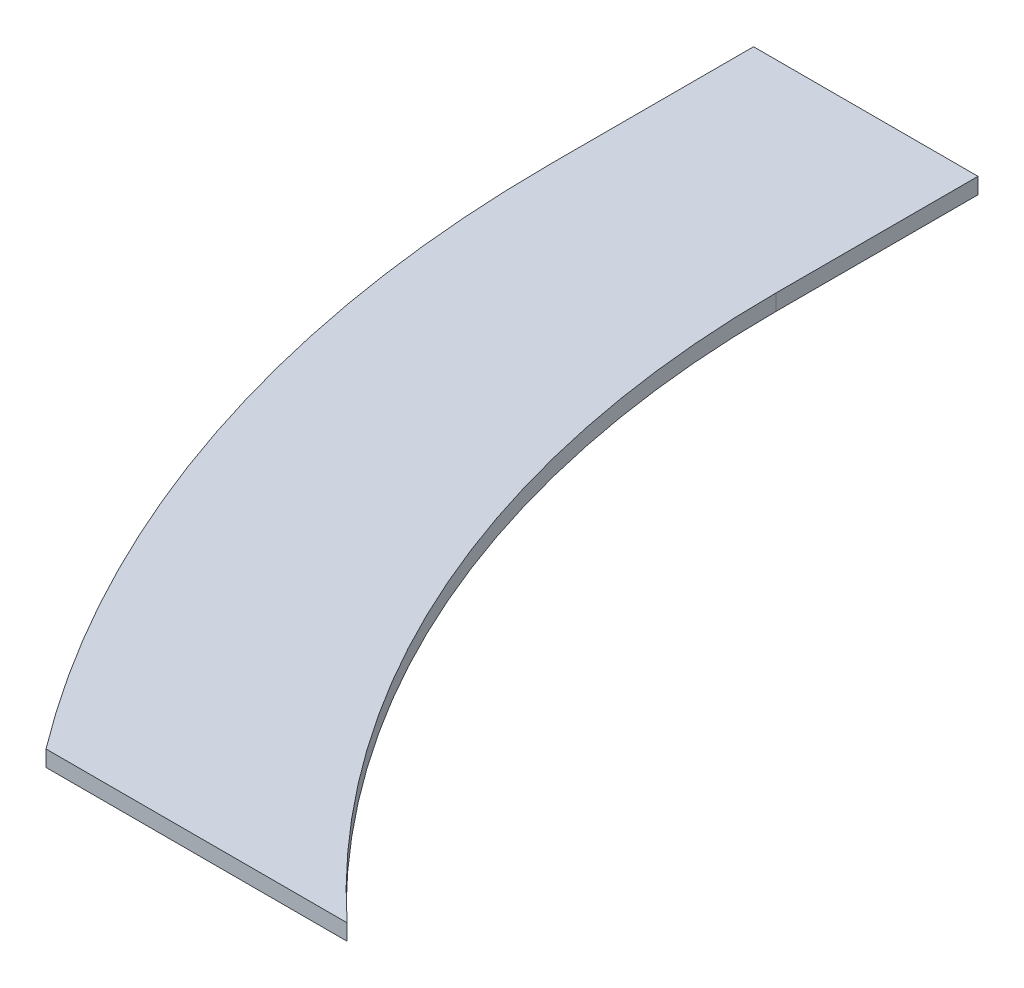
ISO-10303-21;
HEADER;
FILE_DESCRIPTION(('STEP AP214'),'2;1');
FILE_NAME('part.step','',(''),(''),'','','');
FILE_SCHEMA(('AUTOMOTIVE_DESIGN { 1 0 10303 214 1 1 1 1 }'));
ENDSEC;
DATA;
#1=APPLICATION_CONTEXT('core data for automotive mechanical design processes');
#2=APPLICATION_PROTOCOL_DEFINITION('international standard','automotive_design',2000,#1);
#3=PRODUCT_CONTEXT('',#1,'mechanical');
#4=PRODUCT('Part','Part','',(#3));
#5=PRODUCT_RELATED_PRODUCT_CATEGORY('part','',(#4));
#6=PRODUCT_DEFINITION_FORMATION('','',#4);
#7=PRODUCT_DEFINITION_CONTEXT('part definition',#1,'design');
#8=PRODUCT_DEFINITION('design','',#6,#7);
#9=PRODUCT_DEFINITION_SHAPE('','',#8);
#10=(LENGTH_UNIT() NAMED_UNIT(*) SI_UNIT(.MILLI.,.METRE.));
#11=(NAMED_UNIT(*) PLANE_ANGLE_UNIT() SI_UNIT($,.RADIAN.));
#12=(NAMED_UNIT(*) SI_UNIT($,.STERADIAN.) SOLID_ANGLE_UNIT());
#13=UNCERTAINTY_MEASURE_WITH_UNIT(LENGTH_MEASURE(1.E-05),#10,'distance_accuracy_value','');
#14=(GEOMETRIC_REPRESENTATION_CONTEXT(3) GLOBAL_UNCERTAINTY_ASSIGNED_CONTEXT((#13)) GLOBAL_UNIT_ASSIGNED_CONTEXT((#10,
#11,#12)) REPRESENTATION_CONTEXT('',''));
#15=CARTESIAN_POINT('',(0.,0.,0.));
#16=DIRECTION('',(0.,0.,1.));
#17=DIRECTION('',(1.,0.,0.));
#18=AXIS2_PLACEMENT_3D('',#15,#16,#17);
#19=CARTESIAN_POINT('',(0.,0.,301.));
#20=DIRECTION('',(0.,0.,-1.));
#21=DIRECTION('',(-1.,0.,0.));
#22=AXIS2_PLACEMENT_3D('',#19,#20,#21);
#23=PLANE('',#22);
#24=DIRECTION('',(-1.,0.,0.));
#25=VECTOR('',#24,1.);
#26=CARTESIAN_POINT('',(0.,6.35,301.));
#27=LINE('',#26,#25);
#28=CARTESIAN_POINT('',(-280.003946400761,6.35,301.));
#29=VERTEX_POINT('',#28);
#30=CARTESIAN_POINT('',(-399.248043201216,6.35,301.));
#31=VERTEX_POINT('',#30);
#32=EDGE_CURVE('E12',#29,#31,#27,.T.);
#33=ORIENTED_EDGE('',*,*,#32,.T.);
#34=DIRECTION('',(0.,-1.,0.));
#35=VECTOR('',#34,1.);
#36=CARTESIAN_POINT('',(-399.248043201216,6.35,301.));
#37=LINE('',#36,#35);
#38=CARTESIAN_POINT('',(-399.248043201216,0.,301.));
#39=VERTEX_POINT('',#38);
#40=EDGE_CURVE('E62',#39,#31,#37,.F.);
#41=ORIENTED_EDGE('',*,*,#40,.F.);
#42=DIRECTION('',(-1.,0.,0.));
#43=VECTOR('',#42,1.);
#44=CARTESIAN_POINT('',(0.,0.,301.));
#45=LINE('',#44,#43);
#46=CARTESIAN_POINT('',(-280.003946400761,0.,301.));
#47=VERTEX_POINT('',#46);
#48=EDGE_CURVE('E136',#47,#39,#45,.T.);
#49=ORIENTED_EDGE('',*,*,#48,.F.);
#50=DIRECTION('',(0.,-1.,0.));
#51=VECTOR('',#50,1.);
#52=CARTESIAN_POINT('',(-280.003946400761,6.35,301.));
#53=LINE('',#52,#51);
#54=EDGE_CURVE('E49',#47,#29,#53,.F.);
#55=ORIENTED_EDGE('',*,*,#54,.T.);
#56=EDGE_LOOP('',(#33,#41,#49,#55));
#57=FACE_BOUND('',#56,.T.);
#58=ADVANCED_FACE('F42',(#57),#23,.F.);
#59=CARTESIAN_POINT('',(-411.1,6.35,-79.9999999999999));
#60=DIRECTION('',(-1.,0.,0.));
#61=DIRECTION('',(0.,0.,1.));
#62=AXIS2_PLACEMENT_3D('',#59,#60,#61);
#63=PLANE('',#62);
#64=DIRECTION('',(0.,-1.,0.));
#65=VECTOR('',#64,1.);
#66=CARTESIAN_POINT('',(-411.1,6.35,0.));
#67=LINE('',#66,#65);
#68=CARTESIAN_POINT('',(-411.1,6.35,0.));
#69=VERTEX_POINT('',#68);
#70=CARTESIAN_POINT('',(-411.1,0.,0.));
#71=VERTEX_POINT('',#70);
#72=EDGE_CURVE('E117',#69,#71,#67,.T.);
#73=ORIENTED_EDGE('',*,*,#72,.T.);
#74=DIRECTION('',(0.,0.,1.));
#75=VECTOR('',#74,1.);
#76=CARTESIAN_POINT('',(-411.1,0.,-79.9999999999999));
#77=LINE('',#76,#75);
#78=CARTESIAN_POINT('',(-411.1,0.,-79.9999999999999));
#79=VERTEX_POINT('',#78);
#80=EDGE_CURVE('E98',#79,#71,#77,.T.);
#81=ORIENTED_EDGE('',*,*,#80,.F.);
#82=DIRECTION('',(0.,-1.,0.));
#83=VECTOR('',#82,1.);
#84=CARTESIAN_POINT('',(-411.1,6.35,-79.9999999999999));
#85=LINE('',#84,#83);
#86=CARTESIAN_POINT('',(-411.1,6.35,-79.9999999999999));
#87=VERTEX_POINT('',#86);
#88=EDGE_CURVE('E106',#87,#79,#85,.T.);
#89=ORIENTED_EDGE('',*,*,#88,.F.);
#90=DIRECTION('',(0.,0.,1.));
#91=VECTOR('',#90,1.);
#92=CARTESIAN_POINT('',(-411.1,6.35,-79.9999999999999));
#93=LINE('',#92,#91);
#94=EDGE_CURVE('E146',#87,#69,#93,.T.);
#95=ORIENTED_EDGE('',*,*,#94,.T.);
#96=EDGE_LOOP('',(#73,#81,#89,#95));
#97=FACE_BOUND('',#96,.T.);
#98=ADVANCED_FACE('F116',(#97),#63,.F.);
#99=CARTESIAN_POINT('',(0.,0.,-80.));
#100=DIRECTION('',(0.,0.,-1.));
#101=DIRECTION('',(-1.,0.,0.));
#102=AXIS2_PLACEMENT_3D('',#99,#100,#101);
#103=PLANE('',#102);
#104=ORIENTED_EDGE('',*,*,#88,.T.);
#105=DIRECTION('',(-1.,0.,0.));
#106=VECTOR('',#105,1.);
#107=CARTESIAN_POINT('',(-411.1,0.,-79.9999999999999));
#108=LINE('',#107,#106);
#109=CARTESIAN_POINT('',(-500.,0.,-79.9999999999999));
#110=VERTEX_POINT('',#109);
#111=EDGE_CURVE('E93',#79,#110,#108,.T.);
#112=ORIENTED_EDGE('',*,*,#111,.T.);
#113=DIRECTION('',(0.,1.,0.));
#114=VECTOR('',#113,1.);
#115=CARTESIAN_POINT('',(-500.,0.,-79.9999999999999));
#116=LINE('',#115,#114);
#117=CARTESIAN_POINT('',(-500.,6.35,-79.9999999999999));
#118=VERTEX_POINT('',#117);
#119=EDGE_CURVE('E105',#110,#118,#116,.T.);
#120=ORIENTED_EDGE('',*,*,#119,.T.);
#121=DIRECTION('',(1.,0.,0.));
#122=VECTOR('',#121,1.);
#123=CARTESIAN_POINT('',(-500.,6.35,-79.9999999999999));
#124=LINE('',#123,#122);
#125=EDGE_CURVE('E111',#118,#87,#124,.T.);
#126=ORIENTED_EDGE('',*,*,#125,.T.);
#127=EDGE_LOOP('',(#104,#112,#120,#126));
#128=FACE_BOUND('',#127,.T.);
#129=ADVANCED_FACE('F109',(#128),#103,.T.);
#130=CARTESIAN_POINT('',(-500.,0.,-79.9999999999999));
#131=DIRECTION('',(1.,0.,0.));
#132=DIRECTION('',(0.,0.,-1.));
#133=AXIS2_PLACEMENT_3D('',#130,#131,#132);
#134=PLANE('',#133);
#135=DIRECTION('',(0.,-1.,0.));
#136=VECTOR('',#135,1.);
#137=CARTESIAN_POINT('',(-500.,6.35,0.));
#138=LINE('',#137,#136);
#139=CARTESIAN_POINT('',(-500.,6.35,0.));
#140=VERTEX_POINT('',#139);
#141=CARTESIAN_POINT('',(-500.,0.,0.));
#142=VERTEX_POINT('',#141);
#143=EDGE_CURVE('E131',#140,#142,#138,.T.);
#144=ORIENTED_EDGE('',*,*,#143,.F.);
#145=DIRECTION('',(0.,0.,1.));
#146=VECTOR('',#145,1.);
#147=CARTESIAN_POINT('',(-500.,6.35,-79.9999999999999));
#148=LINE('',#147,#146);
#149=EDGE_CURVE('E122',#118,#140,#148,.T.);
#150=ORIENTED_EDGE('',*,*,#149,.F.);
#151=ORIENTED_EDGE('',*,*,#119,.F.);
#152=DIRECTION('',(0.,0.,1.));
#153=VECTOR('',#152,1.);
#154=CARTESIAN_POINT('',(-500.,0.,-79.9999999999999));
#155=LINE('',#154,#153);
#156=EDGE_CURVE('E102',#110,#142,#155,.T.);
#157=ORIENTED_EDGE('',*,*,#156,.T.);
#158=EDGE_LOOP('',(#144,#150,#151,#157));
#159=FACE_BOUND('',#158,.T.);
#160=ADVANCED_FACE('F143',(#159),#134,.F.);
#161=CARTESIAN_POINT('',(0.,6.35,0.));
#162=DIRECTION('',(0.,-1.,0.));
#163=DIRECTION('',(0.,0.,-1.));
#164=AXIS2_PLACEMENT_3D('',#161,#162,#163);
#165=CYLINDRICAL_SURFACE('',#164,500.);
#166=CARTESIAN_POINT('',(0.,0.,0.));
#167=DIRECTION('',(0.,1.,0.));
#168=DIRECTION('',(0.,0.,1.));
#169=AXIS2_PLACEMENT_3D('',#166,#167,#168);
#170=CIRCLE('',#169,500.);
#171=EDGE_CURVE('E120',#142,#39,#170,.T.);
#172=ORIENTED_EDGE('',*,*,#171,.T.);
#173=ORIENTED_EDGE('',*,*,#40,.T.);
#174=CARTESIAN_POINT('',(0.,6.35,0.));
#175=DIRECTION('',(0.,1.,0.));
#176=DIRECTION('',(0.,0.,1.));
#177=AXIS2_PLACEMENT_3D('',#174,#175,#176);
#178=CIRCLE('',#177,500.);
#179=EDGE_CURVE('E129',#140,#31,#178,.T.);
#180=ORIENTED_EDGE('',*,*,#179,.F.);
#181=ORIENTED_EDGE('',*,*,#143,.T.);
#182=EDGE_LOOP('',(#172,#173,#180,#181));
#183=FACE_BOUND('',#182,.T.);
#184=ADVANCED_FACE('F138',(#183),#165,.T.);
#185=CARTESIAN_POINT('',(0.,6.35,0.));
#186=DIRECTION('',(0.,-1.,0.));
#187=DIRECTION('',(0.,0.,-1.));
#188=AXIS2_PLACEMENT_3D('',#185,#186,#187);
#189=CYLINDRICAL_SURFACE('',#188,411.1);
#190=ORIENTED_EDGE('',*,*,#54,.F.);
#191=CARTESIAN_POINT('',(0.,0.,0.));
#192=DIRECTION('',(0.,1.,0.));
#193=DIRECTION('',(0.,0.,1.));
#194=AXIS2_PLACEMENT_3D('',#191,#192,#193);
#195=CIRCLE('',#194,411.1);
#196=EDGE_CURVE('E118',#71,#47,#195,.T.);
#197=ORIENTED_EDGE('',*,*,#196,.F.);
#198=ORIENTED_EDGE('',*,*,#72,.F.);
#199=CARTESIAN_POINT('',(0.,6.35,0.));
#200=DIRECTION('',(0.,1.,0.));
#201=DIRECTION('',(0.,0.,1.));
#202=AXIS2_PLACEMENT_3D('',#199,#200,#201);
#203=CIRCLE('',#202,411.1);
#204=EDGE_CURVE('E126',#69,#29,#203,.T.);
#205=ORIENTED_EDGE('',*,*,#204,.T.);
#206=EDGE_LOOP('',(#190,#197,#198,#205));
#207=FACE_BOUND('',#206,.T.);
#208=ADVANCED_FACE('F152',(#207),#189,.F.);
#209=CARTESIAN_POINT('',(0.,0.,0.));
#210=DIRECTION('',(0.,1.,0.));
#211=DIRECTION('',(0.,0.,1.));
#212=AXIS2_PLACEMENT_3D('',#209,#210,#211);
#213=PLANE('',#212);
#214=ORIENTED_EDGE('',*,*,#196,.T.);
#215=ORIENTED_EDGE('',*,*,#48,.T.);
#216=ORIENTED_EDGE('',*,*,#171,.F.);
#217=ORIENTED_EDGE('',*,*,#156,.F.);
#218=ORIENTED_EDGE('',*,*,#111,.F.);
#219=ORIENTED_EDGE('',*,*,#80,.T.);
#220=EDGE_LOOP('',(#214,#215,#216,#217,#218,#219));
#221=FACE_BOUND('',#220,.T.);
#222=ADVANCED_FACE('F96',(#221),#213,.F.);
#223=CARTESIAN_POINT('',(0.,6.35,0.));
#224=DIRECTION('',(0.,1.,0.));
#225=DIRECTION('',(0.,0.,1.));
#226=AXIS2_PLACEMENT_3D('',#223,#224,#225);
#227=PLANE('',#226);
#228=ORIENTED_EDGE('',*,*,#32,.F.);
#229=ORIENTED_EDGE('',*,*,#204,.F.);
#230=ORIENTED_EDGE('',*,*,#94,.F.);
#231=ORIENTED_EDGE('',*,*,#125,.F.);
#232=ORIENTED_EDGE('',*,*,#149,.T.);
#233=ORIENTED_EDGE('',*,*,#179,.T.);
#234=EDGE_LOOP('',(#228,#229,#230,#231,#232,#233));
#235=FACE_BOUND('',#234,.T.);
#236=ADVANCED_FACE('F145',(#235),#227,.T.);
#237=CLOSED_SHELL('',(#58,#98,#129,#160,#184,#208,#222,#236));
#238=MANIFOLD_SOLID_BREP('B2',#237);
#239=ADVANCED_BREP_SHAPE_REPRESENTATION('',(#18,#238),#14);
#240=SHAPE_DEFINITION_REPRESENTATION(#9,#239);
ENDSEC;
END-ISO-10303-21;
